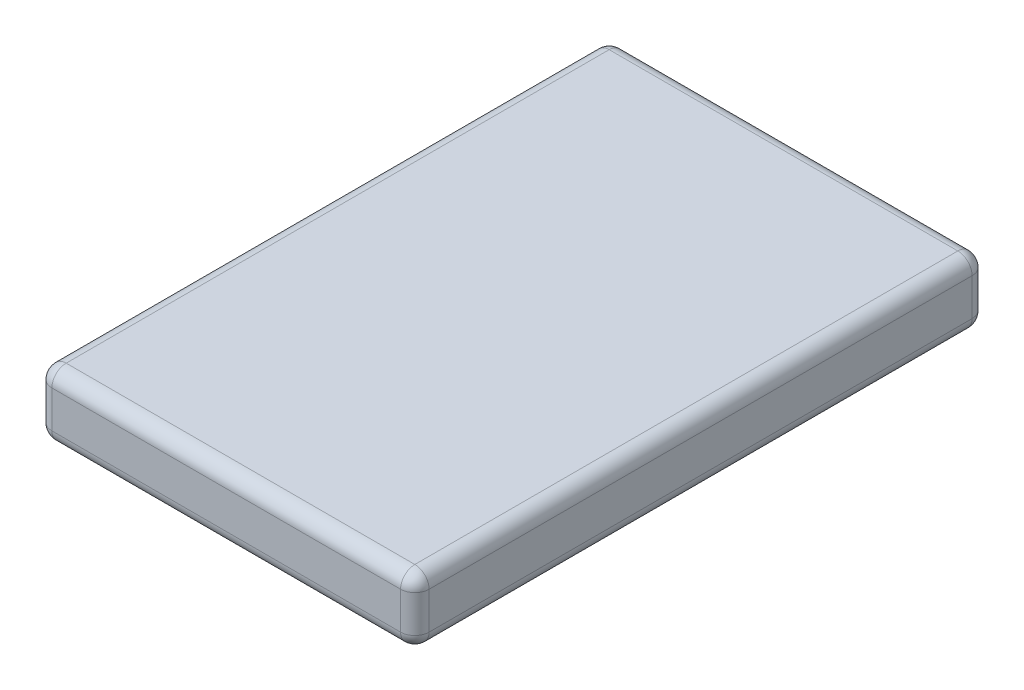
ISO-10303-21;
HEADER;
FILE_DESCRIPTION(('STEP AP214'),'2;1');
FILE_NAME('part.step','',(''),(''),'','','');
FILE_SCHEMA(('AUTOMOTIVE_DESIGN { 1 0 10303 214 1 1 1 1 }'));
ENDSEC;
DATA;
#1=APPLICATION_CONTEXT('core data for automotive mechanical design processes');
#2=APPLICATION_PROTOCOL_DEFINITION('international standard','automotive_design',2000,#1);
#3=PRODUCT_CONTEXT('',#1,'mechanical');
#4=PRODUCT('Part','Part','',(#3));
#5=PRODUCT_RELATED_PRODUCT_CATEGORY('part','',(#4));
#6=PRODUCT_DEFINITION_FORMATION('','',#4);
#7=PRODUCT_DEFINITION_CONTEXT('part definition',#1,'design');
#8=PRODUCT_DEFINITION('design','',#6,#7);
#9=PRODUCT_DEFINITION_SHAPE('','',#8);
#10=(LENGTH_UNIT() NAMED_UNIT(*) SI_UNIT(.MILLI.,.METRE.));
#11=(NAMED_UNIT(*) PLANE_ANGLE_UNIT() SI_UNIT($,.RADIAN.));
#12=(NAMED_UNIT(*) SI_UNIT($,.STERADIAN.) SOLID_ANGLE_UNIT());
#13=UNCERTAINTY_MEASURE_WITH_UNIT(LENGTH_MEASURE(1.E-05),#10,'distance_accuracy_value','');
#14=(GEOMETRIC_REPRESENTATION_CONTEXT(3) GLOBAL_UNCERTAINTY_ASSIGNED_CONTEXT((#13)) GLOBAL_UNIT_ASSIGNED_CONTEXT((#10,
#11,#12)) REPRESENTATION_CONTEXT('',''));
#15=CARTESIAN_POINT('',(0.,0.,0.));
#16=DIRECTION('',(0.,0.,1.));
#17=DIRECTION('',(1.,0.,0.));
#18=AXIS2_PLACEMENT_3D('',#15,#16,#17);
#19=CARTESIAN_POINT('',(0.,5.842,0.));
#20=DIRECTION('',(1.,0.,0.));
#21=DIRECTION('',(0.,0.,-1.));
#22=AXIS2_PLACEMENT_3D('',#19,#20,#21);
#23=PLANE('',#22);
#24=DIRECTION('',(0.,0.,1.));
#25=VECTOR('',#24,1.);
#26=CARTESIAN_POINT('',(0.,4.572,0.));
#27=LINE('',#26,#25);
#28=CARTESIAN_POINT('',(0.,4.572,-1.27));
#29=VERTEX_POINT('',#28);
#30=CARTESIAN_POINT('',(0.,4.572,-49.53));
#31=VERTEX_POINT('',#30);
#32=EDGE_CURVE('E181',#29,#31,#27,.F.);
#33=ORIENTED_EDGE('',*,*,#32,.T.);
#34=DIRECTION('',(0.,-1.,0.));
#35=VECTOR('',#34,1.);
#36=CARTESIAN_POINT('',(0.,5.842,-49.53));
#37=LINE('',#36,#35);
#38=CARTESIAN_POINT('',(0.,1.27,-49.53));
#39=VERTEX_POINT('',#38);
#40=EDGE_CURVE('E183',#31,#39,#37,.T.);
#41=ORIENTED_EDGE('',*,*,#40,.T.);
#42=DIRECTION('',(0.,0.,1.));
#43=VECTOR('',#42,1.);
#44=CARTESIAN_POINT('',(0.,1.27,0.));
#45=LINE('',#44,#43);
#46=CARTESIAN_POINT('',(0.,1.27,-1.27));
#47=VERTEX_POINT('',#46);
#48=EDGE_CURVE('E179',#39,#47,#45,.T.);
#49=ORIENTED_EDGE('',*,*,#48,.T.);
#50=DIRECTION('',(0.,-1.,0.));
#51=VECTOR('',#50,1.);
#52=CARTESIAN_POINT('',(0.,5.842,-1.27));
#53=LINE('',#52,#51);
#54=EDGE_CURVE('E177',#47,#29,#53,.F.);
#55=ORIENTED_EDGE('',*,*,#54,.T.);
#56=EDGE_LOOP('',(#33,#41,#49,#55));
#57=FACE_BOUND('',#56,.T.);
#58=ADVANCED_FACE('F33',(#57),#23,.F.);
#59=CARTESIAN_POINT('',(0.,5.842,0.));
#60=DIRECTION('',(0.,0.,-1.));
#61=DIRECTION('',(-1.,0.,0.));
#62=AXIS2_PLACEMENT_3D('',#59,#60,#61);
#63=PLANE('',#62);
#64=DIRECTION('',(0.,-1.,0.));
#65=VECTOR('',#64,1.);
#66=CARTESIAN_POINT('',(1.27,5.842,0.));
#67=LINE('',#66,#65);
#68=CARTESIAN_POINT('',(1.27,4.572,0.));
#69=VERTEX_POINT('',#68);
#70=CARTESIAN_POINT('',(1.27,1.27,0.));
#71=VERTEX_POINT('',#70);
#72=EDGE_CURVE('E53',#69,#71,#67,.T.);
#73=ORIENTED_EDGE('',*,*,#72,.T.);
#74=DIRECTION('',(1.,0.,0.));
#75=VECTOR('',#74,1.);
#76=CARTESIAN_POINT('',(33.528,1.27,0.));
#77=LINE('',#76,#75);
#78=CARTESIAN_POINT('',(32.258,1.27,0.));
#79=VERTEX_POINT('',#78);
#80=EDGE_CURVE('E11',#71,#79,#77,.T.);
#81=ORIENTED_EDGE('',*,*,#80,.T.);
#82=DIRECTION('',(0.,-1.,0.));
#83=VECTOR('',#82,1.);
#84=CARTESIAN_POINT('',(32.258,5.842,0.));
#85=LINE('',#84,#83);
#86=CARTESIAN_POINT('',(32.258,4.572,0.));
#87=VERTEX_POINT('',#86);
#88=EDGE_CURVE('E42',#79,#87,#85,.F.);
#89=ORIENTED_EDGE('',*,*,#88,.T.);
#90=DIRECTION('',(1.,0.,0.));
#91=VECTOR('',#90,1.);
#92=CARTESIAN_POINT('',(0.,4.572,0.));
#93=LINE('',#92,#91);
#94=EDGE_CURVE('E195',#87,#69,#93,.F.);
#95=ORIENTED_EDGE('',*,*,#94,.T.);
#96=EDGE_LOOP('',(#73,#81,#89,#95));
#97=FACE_BOUND('',#96,.T.);
#98=ADVANCED_FACE('F303',(#97),#63,.F.);
#99=CARTESIAN_POINT('',(33.528,5.842,0.));
#100=DIRECTION('',(-1.,0.,0.));
#101=DIRECTION('',(0.,0.,1.));
#102=AXIS2_PLACEMENT_3D('',#99,#100,#101);
#103=PLANE('',#102);
#104=DIRECTION('',(0.,-1.,0.));
#105=VECTOR('',#104,1.);
#106=CARTESIAN_POINT('',(33.528,5.842,-1.27));
#107=LINE('',#106,#105);
#108=CARTESIAN_POINT('',(33.528,4.572,-1.27));
#109=VERTEX_POINT('',#108);
#110=CARTESIAN_POINT('',(33.528,1.27,-1.27));
#111=VERTEX_POINT('',#110);
#112=EDGE_CURVE('E159',#109,#111,#107,.T.);
#113=ORIENTED_EDGE('',*,*,#112,.T.);
#114=DIRECTION('',(0.,0.,-1.));
#115=VECTOR('',#114,1.);
#116=CARTESIAN_POINT('',(33.528,1.27,-50.8));
#117=LINE('',#116,#115);
#118=CARTESIAN_POINT('',(33.528,1.27,-49.53));
#119=VERTEX_POINT('',#118);
#120=EDGE_CURVE('E166',#111,#119,#117,.T.);
#121=ORIENTED_EDGE('',*,*,#120,.T.);
#122=DIRECTION('',(0.,-1.,0.));
#123=VECTOR('',#122,1.);
#124=CARTESIAN_POINT('',(33.528,5.842,-49.53));
#125=LINE('',#124,#123);
#126=CARTESIAN_POINT('',(33.528,4.572,-49.53));
#127=VERTEX_POINT('',#126);
#128=EDGE_CURVE('E129',#119,#127,#125,.F.);
#129=ORIENTED_EDGE('',*,*,#128,.T.);
#130=DIRECTION('',(0.,0.,-1.));
#131=VECTOR('',#130,1.);
#132=CARTESIAN_POINT('',(33.528,4.572,0.));
#133=LINE('',#132,#131);
#134=EDGE_CURVE('E157',#127,#109,#133,.F.);
#135=ORIENTED_EDGE('',*,*,#134,.T.);
#136=EDGE_LOOP('',(#113,#121,#129,#135));
#137=FACE_BOUND('',#136,.T.);
#138=ADVANCED_FACE('F305',(#137),#103,.F.);
#139=CARTESIAN_POINT('',(0.,5.842,-50.8));
#140=DIRECTION('',(0.,0.,1.));
#141=DIRECTION('',(1.,0.,0.));
#142=AXIS2_PLACEMENT_3D('',#139,#140,#141);
#143=PLANE('',#142);
#144=DIRECTION('',(-1.,0.,0.));
#145=VECTOR('',#144,1.);
#146=CARTESIAN_POINT('',(0.,4.572,-50.8));
#147=LINE('',#146,#145);
#148=CARTESIAN_POINT('',(1.27,4.572,-50.8));
#149=VERTEX_POINT('',#148);
#150=CARTESIAN_POINT('',(32.258,4.572,-50.8));
#151=VERTEX_POINT('',#150);
#152=EDGE_CURVE('E155',#149,#151,#147,.F.);
#153=ORIENTED_EDGE('',*,*,#152,.T.);
#154=DIRECTION('',(0.,-1.,0.));
#155=VECTOR('',#154,1.);
#156=CARTESIAN_POINT('',(32.258,5.842,-50.8));
#157=LINE('',#156,#155);
#158=CARTESIAN_POINT('',(32.258,1.27,-50.8));
#159=VERTEX_POINT('',#158);
#160=EDGE_CURVE('E127',#151,#159,#157,.T.);
#161=ORIENTED_EDGE('',*,*,#160,.T.);
#162=DIRECTION('',(-1.,0.,0.));
#163=VECTOR('',#162,1.);
#164=CARTESIAN_POINT('',(0.,1.27,-50.8));
#165=LINE('',#164,#163);
#166=CARTESIAN_POINT('',(1.27,1.27,-50.8));
#167=VERTEX_POINT('',#166);
#168=EDGE_CURVE('E145',#159,#167,#165,.T.);
#169=ORIENTED_EDGE('',*,*,#168,.T.);
#170=DIRECTION('',(0.,-1.,0.));
#171=VECTOR('',#170,1.);
#172=CARTESIAN_POINT('',(1.27,5.842,-50.8));
#173=LINE('',#172,#171);
#174=EDGE_CURVE('E151',#167,#149,#173,.F.);
#175=ORIENTED_EDGE('',*,*,#174,.T.);
#176=EDGE_LOOP('',(#153,#161,#169,#175));
#177=FACE_BOUND('',#176,.T.);
#178=ADVANCED_FACE('F153',(#177),#143,.F.);
#179=CARTESIAN_POINT('',(0.,5.842,0.));
#180=DIRECTION('',(0.,-1.,0.));
#181=DIRECTION('',(0.,0.,-1.));
#182=AXIS2_PLACEMENT_3D('',#179,#180,#181);
#183=PLANE('',#182);
#184=DIRECTION('',(0.,0.,-1.));
#185=VECTOR('',#184,1.);
#186=CARTESIAN_POINT('',(32.258,5.842,0.));
#187=LINE('',#186,#185);
#188=CARTESIAN_POINT('',(32.258,5.842,-1.27));
#189=VERTEX_POINT('',#188);
#190=CARTESIAN_POINT('',(32.258,5.842,-49.53));
#191=VERTEX_POINT('',#190);
#192=EDGE_CURVE('E170',#189,#191,#187,.T.);
#193=ORIENTED_EDGE('',*,*,#192,.T.);
#194=DIRECTION('',(-1.,0.,0.));
#195=VECTOR('',#194,1.);
#196=CARTESIAN_POINT('',(0.,5.842,-49.53));
#197=LINE('',#196,#195);
#198=CARTESIAN_POINT('',(1.27,5.842,-49.53));
#199=VERTEX_POINT('',#198);
#200=EDGE_CURVE('E174',#191,#199,#197,.T.);
#201=ORIENTED_EDGE('',*,*,#200,.T.);
#202=DIRECTION('',(0.,0.,1.));
#203=VECTOR('',#202,1.);
#204=CARTESIAN_POINT('',(1.27,5.842,0.));
#205=LINE('',#204,#203);
#206=CARTESIAN_POINT('',(1.27,5.842,-1.27));
#207=VERTEX_POINT('',#206);
#208=EDGE_CURVE('E172',#199,#207,#205,.T.);
#209=ORIENTED_EDGE('',*,*,#208,.T.);
#210=DIRECTION('',(1.,0.,0.));
#211=VECTOR('',#210,1.);
#212=CARTESIAN_POINT('',(0.,5.842,-1.27));
#213=LINE('',#212,#211);
#214=EDGE_CURVE('E168',#207,#189,#213,.T.);
#215=ORIENTED_EDGE('',*,*,#214,.T.);
#216=EDGE_LOOP('',(#193,#201,#209,#215));
#217=FACE_BOUND('',#216,.T.);
#218=ADVANCED_FACE('F269',(#217),#183,.F.);
#219=CARTESIAN_POINT('',(0.,0.,0.));
#220=DIRECTION('',(0.,-1.,0.));
#221=DIRECTION('',(0.,0.,-1.));
#222=AXIS2_PLACEMENT_3D('',#219,#220,#221);
#223=PLANE('',#222);
#224=DIRECTION('',(0.,0.,1.));
#225=VECTOR('',#224,1.);
#226=CARTESIAN_POINT('',(1.27,0.,-50.8));
#227=LINE('',#226,#225);
#228=CARTESIAN_POINT('',(1.27,0.,-1.27));
#229=VERTEX_POINT('',#228);
#230=CARTESIAN_POINT('',(1.27,0.,-49.53));
#231=VERTEX_POINT('',#230);
#232=EDGE_CURVE('E190',#229,#231,#227,.F.);
#233=ORIENTED_EDGE('',*,*,#232,.T.);
#234=DIRECTION('',(-1.,0.,0.));
#235=VECTOR('',#234,1.);
#236=CARTESIAN_POINT('',(33.528,0.,-49.53));
#237=LINE('',#236,#235);
#238=CARTESIAN_POINT('',(32.258,0.,-49.53));
#239=VERTEX_POINT('',#238);
#240=EDGE_CURVE('E192',#231,#239,#237,.F.);
#241=ORIENTED_EDGE('',*,*,#240,.T.);
#242=DIRECTION('',(0.,0.,-1.));
#243=VECTOR('',#242,1.);
#244=CARTESIAN_POINT('',(32.258,0.,0.));
#245=LINE('',#244,#243);
#246=CARTESIAN_POINT('',(32.258,0.,-1.27));
#247=VERTEX_POINT('',#246);
#248=EDGE_CURVE('E188',#239,#247,#245,.F.);
#249=ORIENTED_EDGE('',*,*,#248,.T.);
#250=DIRECTION('',(1.,0.,0.));
#251=VECTOR('',#250,1.);
#252=CARTESIAN_POINT('',(0.,0.,-1.27));
#253=LINE('',#252,#251);
#254=EDGE_CURVE('E186',#247,#229,#253,.F.);
#255=ORIENTED_EDGE('',*,*,#254,.T.);
#256=EDGE_LOOP('',(#233,#241,#249,#255));
#257=FACE_BOUND('',#256,.T.);
#258=ADVANCED_FACE('F368',(#257),#223,.T.);
#259=CARTESIAN_POINT('',(1.27,5.842,-1.27));
#260=DIRECTION('',(0.,-1.,0.));
#261=DIRECTION('',(0.,0.,-1.));
#262=AXIS2_PLACEMENT_3D('',#259,#260,#261);
#263=CYLINDRICAL_SURFACE('',#262,1.27);
#264=CARTESIAN_POINT('',(1.27,4.572,-1.27));
#265=DIRECTION('',(0.,1.,0.));
#266=DIRECTION('',(0.,0.,1.));
#267=AXIS2_PLACEMENT_3D('',#264,#265,#266);
#268=CIRCLE('',#267,1.27);
#269=EDGE_CURVE('E37',#29,#69,#268,.T.);
#270=ORIENTED_EDGE('',*,*,#269,.F.);
#271=ORIENTED_EDGE('',*,*,#54,.F.);
#272=CARTESIAN_POINT('',(1.27,1.27,-1.27));
#273=DIRECTION('',(0.,-1.,0.));
#274=DIRECTION('',(0.,0.,-1.));
#275=AXIS2_PLACEMENT_3D('',#272,#273,#274);
#276=CIRCLE('',#275,1.27);
#277=EDGE_CURVE('E248',#71,#47,#276,.T.);
#278=ORIENTED_EDGE('',*,*,#277,.F.);
#279=ORIENTED_EDGE('',*,*,#72,.F.);
#280=EDGE_LOOP('',(#270,#271,#278,#279));
#281=FACE_BOUND('',#280,.T.);
#282=ADVANCED_FACE('F35',(#281),#263,.T.);
#283=CARTESIAN_POINT('',(1.27,4.572,-1.27));
#284=DIRECTION('',(0.,0.,1.));
#285=DIRECTION('',(1.,0.,0.));
#286=AXIS2_PLACEMENT_3D('',#283,#284,#285);
#287=SPHERICAL_SURFACE('',#286,1.27);
#288=CARTESIAN_POINT('',(1.27,4.572,-1.27));
#289=DIRECTION('',(0.,0.,1.));
#290=DIRECTION('',(1.,0.,0.));
#291=AXIS2_PLACEMENT_3D('',#288,#289,#290);
#292=CIRCLE('',#291,1.27);
#293=EDGE_CURVE('E243',#29,#207,#292,.F.);
#294=ORIENTED_EDGE('',*,*,#293,.F.);
#295=ORIENTED_EDGE('',*,*,#269,.T.);
#296=CARTESIAN_POINT('',(1.27,4.572,-1.27));
#297=DIRECTION('',(-1.,0.,0.));
#298=DIRECTION('',(0.,0.,1.));
#299=AXIS2_PLACEMENT_3D('',#296,#297,#298);
#300=CIRCLE('',#299,1.27);
#301=EDGE_CURVE('E246',#207,#69,#300,.F.);
#302=ORIENTED_EDGE('',*,*,#301,.F.);
#303=EDGE_LOOP('',(#294,#295,#302));
#304=FACE_BOUND('',#303,.T.);
#305=ADVANCED_FACE('F258',(#304),#287,.T.);
#306=CARTESIAN_POINT('',(1.27,1.27,-1.27));
#307=DIRECTION('',(0.,0.,1.));
#308=DIRECTION('',(1.,0.,0.));
#309=AXIS2_PLACEMENT_3D('',#306,#307,#308);
#310=SPHERICAL_SURFACE('',#309,1.27);
#311=CARTESIAN_POINT('',(1.27,1.27,-1.27));
#312=DIRECTION('',(-1.,0.,0.));
#313=DIRECTION('',(0.,0.,1.));
#314=AXIS2_PLACEMENT_3D('',#311,#312,#313);
#315=CIRCLE('',#314,1.27);
#316=EDGE_CURVE('E237',#71,#229,#315,.F.);
#317=ORIENTED_EDGE('',*,*,#316,.F.);
#318=ORIENTED_EDGE('',*,*,#277,.T.);
#319=CARTESIAN_POINT('',(1.27,1.27,-1.27));
#320=DIRECTION('',(0.,0.,1.));
#321=DIRECTION('',(1.,0.,0.));
#322=AXIS2_PLACEMENT_3D('',#319,#320,#321);
#323=CIRCLE('',#322,1.27);
#324=EDGE_CURVE('E240',#229,#47,#323,.F.);
#325=ORIENTED_EDGE('',*,*,#324,.F.);
#326=EDGE_LOOP('',(#317,#318,#325));
#327=FACE_BOUND('',#326,.T.);
#328=ADVANCED_FACE('F289',(#327),#310,.T.);
#329=CARTESIAN_POINT('',(0.,4.572,-1.27));
#330=DIRECTION('',(1.,0.,0.));
#331=DIRECTION('',(0.,0.,-1.));
#332=AXIS2_PLACEMENT_3D('',#329,#330,#331);
#333=CYLINDRICAL_SURFACE('',#332,1.27);
#334=ORIENTED_EDGE('',*,*,#301,.T.);
#335=ORIENTED_EDGE('',*,*,#94,.F.);
#336=CARTESIAN_POINT('',(32.258,4.572,-1.27));
#337=DIRECTION('',(1.,0.,0.));
#338=DIRECTION('',(0.,0.,-1.));
#339=AXIS2_PLACEMENT_3D('',#336,#337,#338);
#340=CIRCLE('',#339,1.27);
#341=EDGE_CURVE('E232',#189,#87,#340,.T.);
#342=ORIENTED_EDGE('',*,*,#341,.F.);
#343=ORIENTED_EDGE('',*,*,#214,.F.);
#344=EDGE_LOOP('',(#334,#335,#342,#343));
#345=FACE_BOUND('',#344,.T.);
#346=ADVANCED_FACE('F265',(#345),#333,.T.);
#347=CARTESIAN_POINT('',(1.27,4.572,0.));
#348=DIRECTION('',(0.,0.,1.));
#349=DIRECTION('',(1.,0.,0.));
#350=AXIS2_PLACEMENT_3D('',#347,#348,#349);
#351=CYLINDRICAL_SURFACE('',#350,1.27);
#352=ORIENTED_EDGE('',*,*,#293,.T.);
#353=ORIENTED_EDGE('',*,*,#208,.F.);
#354=CARTESIAN_POINT('',(1.27,4.572,-49.53));
#355=DIRECTION('',(0.,0.,-1.));
#356=DIRECTION('',(-1.,0.,0.));
#357=AXIS2_PLACEMENT_3D('',#354,#355,#356);
#358=CIRCLE('',#357,1.27);
#359=EDGE_CURVE('E229',#31,#199,#358,.T.);
#360=ORIENTED_EDGE('',*,*,#359,.F.);
#361=ORIENTED_EDGE('',*,*,#32,.F.);
#362=EDGE_LOOP('',(#352,#353,#360,#361));
#363=FACE_BOUND('',#362,.T.);
#364=ADVANCED_FACE('F275',(#363),#351,.T.);
#365=CARTESIAN_POINT('',(1.27,5.842,-49.53));
#366=DIRECTION('',(0.,-1.,0.));
#367=DIRECTION('',(0.,0.,-1.));
#368=AXIS2_PLACEMENT_3D('',#365,#366,#367);
#369=CYLINDRICAL_SURFACE('',#368,1.27);
#370=CARTESIAN_POINT('',(1.27,1.27,-49.53));
#371=DIRECTION('',(0.,-1.,0.));
#372=DIRECTION('',(0.,0.,-1.));
#373=AXIS2_PLACEMENT_3D('',#370,#371,#372);
#374=CIRCLE('',#373,1.27);
#375=EDGE_CURVE('E223',#39,#167,#374,.T.);
#376=ORIENTED_EDGE('',*,*,#375,.F.);
#377=ORIENTED_EDGE('',*,*,#40,.F.);
#378=CARTESIAN_POINT('',(1.27,4.572,-49.53));
#379=DIRECTION('',(0.,1.,0.));
#380=DIRECTION('',(0.,0.,1.));
#381=AXIS2_PLACEMENT_3D('',#378,#379,#380);
#382=CIRCLE('',#381,1.27);
#383=EDGE_CURVE('E226',#149,#31,#382,.T.);
#384=ORIENTED_EDGE('',*,*,#383,.F.);
#385=ORIENTED_EDGE('',*,*,#174,.F.);
#386=EDGE_LOOP('',(#376,#377,#384,#385));
#387=FACE_BOUND('',#386,.T.);
#388=ADVANCED_FACE('F281',(#387),#369,.T.);
#389=CARTESIAN_POINT('',(1.27,1.27,0.));
#390=DIRECTION('',(0.,0.,-1.));
#391=DIRECTION('',(-1.,0.,0.));
#392=AXIS2_PLACEMENT_3D('',#389,#390,#391);
#393=CYLINDRICAL_SURFACE('',#392,1.27);
#394=ORIENTED_EDGE('',*,*,#324,.T.);
#395=ORIENTED_EDGE('',*,*,#48,.F.);
#396=CARTESIAN_POINT('',(1.27,1.27,-49.53));
#397=DIRECTION('',(0.,0.,-1.));
#398=DIRECTION('',(-1.,0.,0.));
#399=AXIS2_PLACEMENT_3D('',#396,#397,#398);
#400=CIRCLE('',#399,1.27);
#401=EDGE_CURVE('E221',#231,#39,#400,.T.);
#402=ORIENTED_EDGE('',*,*,#401,.F.);
#403=ORIENTED_EDGE('',*,*,#232,.F.);
#404=EDGE_LOOP('',(#394,#395,#402,#403));
#405=FACE_BOUND('',#404,.T.);
#406=ADVANCED_FACE('F287',(#405),#393,.T.);
#407=CARTESIAN_POINT('',(0.,1.27,-1.27));
#408=DIRECTION('',(-1.,0.,0.));
#409=DIRECTION('',(0.,0.,1.));
#410=AXIS2_PLACEMENT_3D('',#407,#408,#409);
#411=CYLINDRICAL_SURFACE('',#410,1.27);
#412=ORIENTED_EDGE('',*,*,#316,.T.);
#413=ORIENTED_EDGE('',*,*,#254,.F.);
#414=CARTESIAN_POINT('',(32.258,1.27,-1.27));
#415=DIRECTION('',(1.,0.,0.));
#416=DIRECTION('',(0.,0.,-1.));
#417=AXIS2_PLACEMENT_3D('',#414,#415,#416);
#418=CIRCLE('',#417,1.27);
#419=EDGE_CURVE('E218',#79,#247,#418,.T.);
#420=ORIENTED_EDGE('',*,*,#419,.F.);
#421=ORIENTED_EDGE('',*,*,#80,.F.);
#422=EDGE_LOOP('',(#412,#413,#420,#421));
#423=FACE_BOUND('',#422,.T.);
#424=ADVANCED_FACE('F293',(#423),#411,.T.);
#425=CARTESIAN_POINT('',(32.258,5.842,-1.27));
#426=DIRECTION('',(0.,-1.,0.));
#427=DIRECTION('',(0.,0.,-1.));
#428=AXIS2_PLACEMENT_3D('',#425,#426,#427);
#429=CYLINDRICAL_SURFACE('',#428,1.27);
#430=CARTESIAN_POINT('',(32.258,4.572,-1.27));
#431=DIRECTION('',(0.,1.,0.));
#432=DIRECTION('',(0.,0.,1.));
#433=AXIS2_PLACEMENT_3D('',#430,#431,#432);
#434=CIRCLE('',#433,1.27);
#435=EDGE_CURVE('E234',#87,#109,#434,.T.);
#436=ORIENTED_EDGE('',*,*,#435,.F.);
#437=ORIENTED_EDGE('',*,*,#88,.F.);
#438=CARTESIAN_POINT('',(32.258,1.27,-1.27));
#439=DIRECTION('',(0.,-1.,0.));
#440=DIRECTION('',(0.,0.,-1.));
#441=AXIS2_PLACEMENT_3D('',#438,#439,#440);
#442=CIRCLE('',#441,1.27);
#443=EDGE_CURVE('E215',#111,#79,#442,.T.);
#444=ORIENTED_EDGE('',*,*,#443,.F.);
#445=ORIENTED_EDGE('',*,*,#112,.F.);
#446=EDGE_LOOP('',(#436,#437,#444,#445));
#447=FACE_BOUND('',#446,.T.);
#448=ADVANCED_FACE('F302',(#447),#429,.T.);
#449=CARTESIAN_POINT('',(32.258,4.572,-1.27));
#450=DIRECTION('',(0.,0.,1.));
#451=DIRECTION('',(1.,0.,0.));
#452=AXIS2_PLACEMENT_3D('',#449,#450,#451);
#453=SPHERICAL_SURFACE('',#452,1.27);
#454=ORIENTED_EDGE('',*,*,#341,.T.);
#455=ORIENTED_EDGE('',*,*,#435,.T.);
#456=CARTESIAN_POINT('',(32.258,4.572,-1.27));
#457=DIRECTION('',(0.,0.,1.));
#458=DIRECTION('',(1.,0.,0.));
#459=AXIS2_PLACEMENT_3D('',#456,#457,#458);
#460=CIRCLE('',#459,1.27);
#461=EDGE_CURVE('E212',#189,#109,#460,.F.);
#462=ORIENTED_EDGE('',*,*,#461,.F.);
#463=EDGE_LOOP('',(#454,#455,#462));
#464=FACE_BOUND('',#463,.T.);
#465=ADVANCED_FACE('F346',(#464),#453,.T.);
#466=CARTESIAN_POINT('',(1.27,4.572,-49.53));
#467=DIRECTION('',(0.,0.,1.));
#468=DIRECTION('',(1.,0.,0.));
#469=AXIS2_PLACEMENT_3D('',#466,#467,#468);
#470=SPHERICAL_SURFACE('',#469,1.27);
#471=ORIENTED_EDGE('',*,*,#383,.T.);
#472=ORIENTED_EDGE('',*,*,#359,.T.);
#473=CARTESIAN_POINT('',(1.27,4.572,-49.53));
#474=DIRECTION('',(-1.,0.,0.));
#475=DIRECTION('',(0.,0.,1.));
#476=AXIS2_PLACEMENT_3D('',#473,#474,#475);
#477=CIRCLE('',#476,1.27);
#478=EDGE_CURVE('E210',#149,#199,#477,.F.);
#479=ORIENTED_EDGE('',*,*,#478,.F.);
#480=EDGE_LOOP('',(#471,#472,#479));
#481=FACE_BOUND('',#480,.T.);
#482=ADVANCED_FACE('F343',(#481),#470,.T.);
#483=CARTESIAN_POINT('',(1.27,1.27,-49.53));
#484=DIRECTION('',(0.,0.,1.));
#485=DIRECTION('',(1.,0.,0.));
#486=AXIS2_PLACEMENT_3D('',#483,#484,#485);
#487=SPHERICAL_SURFACE('',#486,1.27);
#488=ORIENTED_EDGE('',*,*,#401,.T.);
#489=ORIENTED_EDGE('',*,*,#375,.T.);
#490=CARTESIAN_POINT('',(1.27,1.27,-49.53));
#491=DIRECTION('',(-1.,0.,0.));
#492=DIRECTION('',(0.,0.,1.));
#493=AXIS2_PLACEMENT_3D('',#490,#491,#492);
#494=CIRCLE('',#493,1.27);
#495=EDGE_CURVE('E148',#231,#167,#494,.F.);
#496=ORIENTED_EDGE('',*,*,#495,.F.);
#497=EDGE_LOOP('',(#488,#489,#496));
#498=FACE_BOUND('',#497,.T.);
#499=ADVANCED_FACE('F340',(#498),#487,.T.);
#500=CARTESIAN_POINT('',(32.258,1.27,-1.27));
#501=DIRECTION('',(0.,0.,1.));
#502=DIRECTION('',(1.,0.,0.));
#503=AXIS2_PLACEMENT_3D('',#500,#501,#502);
#504=SPHERICAL_SURFACE('',#503,1.27);
#505=ORIENTED_EDGE('',*,*,#443,.T.);
#506=ORIENTED_EDGE('',*,*,#419,.T.);
#507=CARTESIAN_POINT('',(32.258,1.27,-1.27));
#508=DIRECTION('',(0.,0.,1.));
#509=DIRECTION('',(1.,0.,0.));
#510=AXIS2_PLACEMENT_3D('',#507,#508,#509);
#511=CIRCLE('',#510,1.27);
#512=EDGE_CURVE('E206',#111,#247,#511,.F.);
#513=ORIENTED_EDGE('',*,*,#512,.F.);
#514=EDGE_LOOP('',(#505,#506,#513));
#515=FACE_BOUND('',#514,.T.);
#516=ADVANCED_FACE('F297',(#515),#504,.T.);
#517=CARTESIAN_POINT('',(32.258,4.572,0.));
#518=DIRECTION('',(0.,0.,-1.));
#519=DIRECTION('',(-1.,0.,0.));
#520=AXIS2_PLACEMENT_3D('',#517,#518,#519);
#521=CYLINDRICAL_SURFACE('',#520,1.27);
#522=ORIENTED_EDGE('',*,*,#461,.T.);
#523=ORIENTED_EDGE('',*,*,#134,.F.);
#524=CARTESIAN_POINT('',(32.258,4.572,-49.53));
#525=DIRECTION('',(0.,0.,-1.));
#526=DIRECTION('',(-1.,0.,0.));
#527=AXIS2_PLACEMENT_3D('',#524,#525,#526);
#528=CIRCLE('',#527,1.27);
#529=EDGE_CURVE('E203',#191,#127,#528,.T.);
#530=ORIENTED_EDGE('',*,*,#529,.F.);
#531=ORIENTED_EDGE('',*,*,#192,.F.);
#532=EDGE_LOOP('',(#522,#523,#530,#531));
#533=FACE_BOUND('',#532,.T.);
#534=ADVANCED_FACE('F333',(#533),#521,.T.);
#535=CARTESIAN_POINT('',(0.,4.572,-49.53));
#536=DIRECTION('',(-1.,0.,0.));
#537=DIRECTION('',(0.,0.,1.));
#538=AXIS2_PLACEMENT_3D('',#535,#536,#537);
#539=CYLINDRICAL_SURFACE('',#538,1.27);
#540=ORIENTED_EDGE('',*,*,#478,.T.);
#541=ORIENTED_EDGE('',*,*,#200,.F.);
#542=CARTESIAN_POINT('',(32.258,4.572,-49.53));
#543=DIRECTION('',(1.,0.,0.));
#544=DIRECTION('',(0.,0.,-1.));
#545=AXIS2_PLACEMENT_3D('',#542,#543,#544);
#546=CIRCLE('',#545,1.27);
#547=EDGE_CURVE('E142',#151,#191,#546,.T.);
#548=ORIENTED_EDGE('',*,*,#547,.F.);
#549=ORIENTED_EDGE('',*,*,#152,.F.);
#550=EDGE_LOOP('',(#540,#541,#548,#549));
#551=FACE_BOUND('',#550,.T.);
#552=ADVANCED_FACE('F330',(#551),#539,.T.);
#553=CARTESIAN_POINT('',(0.,1.27,-49.53));
#554=DIRECTION('',(1.,0.,0.));
#555=DIRECTION('',(0.,0.,-1.));
#556=AXIS2_PLACEMENT_3D('',#553,#554,#555);
#557=CYLINDRICAL_SURFACE('',#556,1.27);
#558=ORIENTED_EDGE('',*,*,#495,.T.);
#559=ORIENTED_EDGE('',*,*,#168,.F.);
#560=CARTESIAN_POINT('',(32.258,1.27,-49.53));
#561=DIRECTION('',(1.,0.,0.));
#562=DIRECTION('',(0.,0.,-1.));
#563=AXIS2_PLACEMENT_3D('',#560,#561,#562);
#564=CIRCLE('',#563,1.27);
#565=EDGE_CURVE('E134',#239,#159,#564,.T.);
#566=ORIENTED_EDGE('',*,*,#565,.F.);
#567=ORIENTED_EDGE('',*,*,#240,.F.);
#568=EDGE_LOOP('',(#558,#559,#566,#567));
#569=FACE_BOUND('',#568,.T.);
#570=ADVANCED_FACE('F146',(#569),#557,.T.);
#571=CARTESIAN_POINT('',(32.258,1.27,0.));
#572=DIRECTION('',(0.,0.,1.));
#573=DIRECTION('',(1.,0.,0.));
#574=AXIS2_PLACEMENT_3D('',#571,#572,#573);
#575=CYLINDRICAL_SURFACE('',#574,1.27);
#576=ORIENTED_EDGE('',*,*,#512,.T.);
#577=ORIENTED_EDGE('',*,*,#248,.F.);
#578=CARTESIAN_POINT('',(32.258,1.27,-49.53));
#579=DIRECTION('',(0.,0.,-1.));
#580=DIRECTION('',(-1.,0.,0.));
#581=AXIS2_PLACEMENT_3D('',#578,#579,#580);
#582=CIRCLE('',#581,1.27);
#583=EDGE_CURVE('E138',#119,#239,#582,.T.);
#584=ORIENTED_EDGE('',*,*,#583,.F.);
#585=ORIENTED_EDGE('',*,*,#120,.F.);
#586=EDGE_LOOP('',(#576,#577,#584,#585));
#587=FACE_BOUND('',#586,.T.);
#588=ADVANCED_FACE('F323',(#587),#575,.T.);
#589=CARTESIAN_POINT('',(32.258,4.572,-49.53));
#590=DIRECTION('',(0.,0.,1.));
#591=DIRECTION('',(1.,0.,0.));
#592=AXIS2_PLACEMENT_3D('',#589,#590,#591);
#593=SPHERICAL_SURFACE('',#592,1.27);
#594=ORIENTED_EDGE('',*,*,#547,.T.);
#595=ORIENTED_EDGE('',*,*,#529,.T.);
#596=CARTESIAN_POINT('',(32.258,4.572,-49.53));
#597=DIRECTION('',(0.,1.,0.));
#598=DIRECTION('',(0.,0.,1.));
#599=AXIS2_PLACEMENT_3D('',#596,#597,#598);
#600=CIRCLE('',#599,1.27);
#601=EDGE_CURVE('E131',#151,#127,#600,.F.);
#602=ORIENTED_EDGE('',*,*,#601,.F.);
#603=EDGE_LOOP('',(#594,#595,#602));
#604=FACE_BOUND('',#603,.T.);
#605=ADVANCED_FACE('F320',(#604),#593,.T.);
#606=CARTESIAN_POINT('',(32.258,1.27,-49.53));
#607=DIRECTION('',(0.,0.,1.));
#608=DIRECTION('',(1.,0.,0.));
#609=AXIS2_PLACEMENT_3D('',#606,#607,#608);
#610=SPHERICAL_SURFACE('',#609,1.27);
#611=ORIENTED_EDGE('',*,*,#583,.T.);
#612=ORIENTED_EDGE('',*,*,#565,.T.);
#613=CARTESIAN_POINT('',(32.258,1.27,-49.53));
#614=DIRECTION('',(0.,-1.,0.));
#615=DIRECTION('',(0.,0.,-1.));
#616=AXIS2_PLACEMENT_3D('',#613,#614,#615);
#617=CIRCLE('',#616,1.27);
#618=EDGE_CURVE('E123',#119,#159,#617,.F.);
#619=ORIENTED_EDGE('',*,*,#618,.F.);
#620=EDGE_LOOP('',(#611,#612,#619));
#621=FACE_BOUND('',#620,.T.);
#622=ADVANCED_FACE('F136',(#621),#610,.T.);
#623=CARTESIAN_POINT('',(32.258,5.842,-49.53));
#624=DIRECTION('',(0.,-1.,0.));
#625=DIRECTION('',(0.,0.,-1.));
#626=AXIS2_PLACEMENT_3D('',#623,#624,#625);
#627=CYLINDRICAL_SURFACE('',#626,1.27);
#628=ORIENTED_EDGE('',*,*,#601,.T.);
#629=ORIENTED_EDGE('',*,*,#128,.F.);
#630=ORIENTED_EDGE('',*,*,#618,.T.);
#631=ORIENTED_EDGE('',*,*,#160,.F.);
#632=EDGE_LOOP('',(#628,#629,#630,#631));
#633=FACE_BOUND('',#632,.T.);
#634=ADVANCED_FACE('F125',(#633),#627,.T.);
#635=CLOSED_SHELL('',(#58,#98,#138,#178,#218,#258,#282,#305,#328,#346,#364,#388,#406,#424,#448,
#465,#482,#499,#516,#534,#552,#570,#588,#605,#622,#634));
#636=MANIFOLD_SOLID_BREP('B2',#635);
#637=ADVANCED_BREP_SHAPE_REPRESENTATION('',(#18,#636),#14);
#638=SHAPE_DEFINITION_REPRESENTATION(#9,#637);
ENDSEC;
END-ISO-10303-21;
